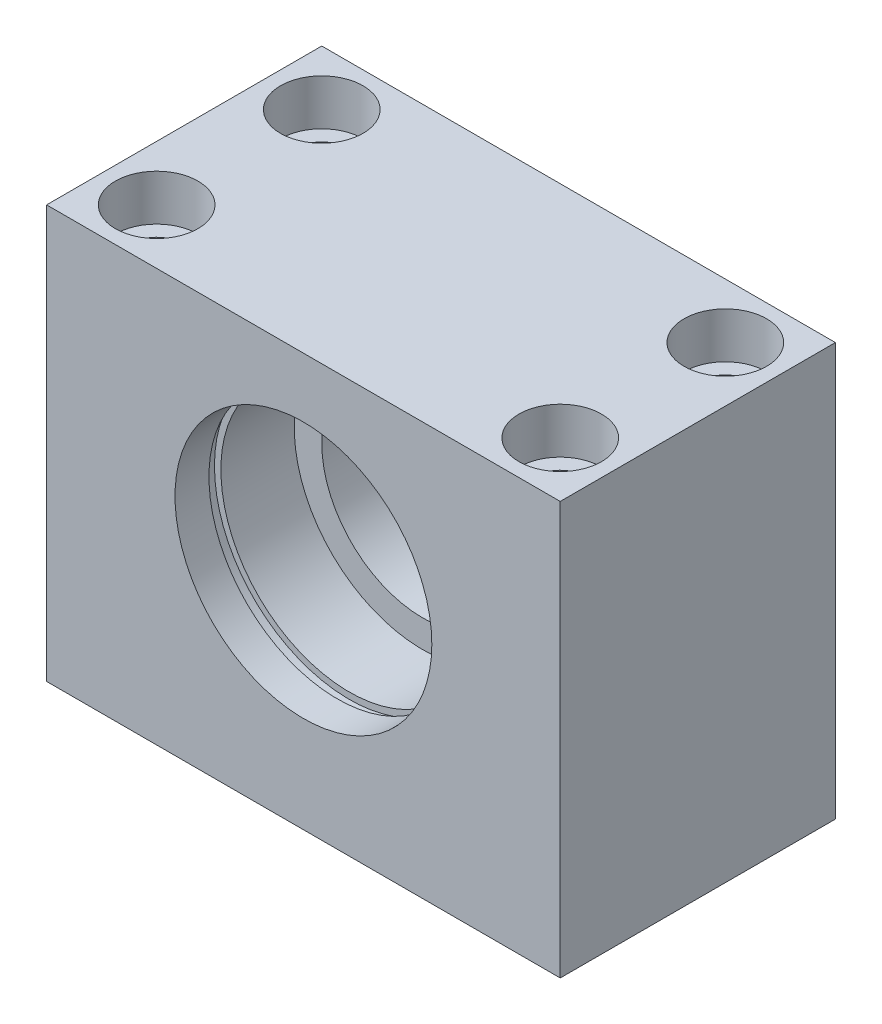
ISO-10303-21;
HEADER;
FILE_DESCRIPTION(('STEP AP214'),'2;1');
FILE_NAME('part.step','',(''),(''),'','','');
FILE_SCHEMA(('AUTOMOTIVE_DESIGN { 1 0 10303 214 1 1 1 1 }'));
ENDSEC;
DATA;
#1=APPLICATION_CONTEXT('core data for automotive mechanical design processes');
#2=APPLICATION_PROTOCOL_DEFINITION('international standard','automotive_design',2000,#1);
#3=PRODUCT_CONTEXT('',#1,'mechanical');
#4=PRODUCT('Part','Part','',(#3));
#5=PRODUCT_RELATED_PRODUCT_CATEGORY('part','',(#4));
#6=PRODUCT_DEFINITION_FORMATION('','',#4);
#7=PRODUCT_DEFINITION_CONTEXT('part definition',#1,'design');
#8=PRODUCT_DEFINITION('design','',#6,#7);
#9=PRODUCT_DEFINITION_SHAPE('','',#8);
#10=(LENGTH_UNIT() NAMED_UNIT(*) SI_UNIT(.MILLI.,.METRE.));
#11=(NAMED_UNIT(*) PLANE_ANGLE_UNIT() SI_UNIT($,.RADIAN.));
#12=(NAMED_UNIT(*) SI_UNIT($,.STERADIAN.) SOLID_ANGLE_UNIT());
#13=UNCERTAINTY_MEASURE_WITH_UNIT(LENGTH_MEASURE(1.E-05),#10,'distance_accuracy_value','');
#14=(GEOMETRIC_REPRESENTATION_CONTEXT(3) GLOBAL_UNCERTAINTY_ASSIGNED_CONTEXT((#13)) GLOBAL_UNIT_ASSIGNED_CONTEXT((#10,
#11,#12)) REPRESENTATION_CONTEXT('',''));
#15=CARTESIAN_POINT('',(0.,0.,0.));
#16=DIRECTION('',(0.,0.,1.));
#17=DIRECTION('',(1.,0.,0.));
#18=AXIS2_PLACEMENT_3D('',#15,#16,#17);
#19=CARTESIAN_POINT('',(0.,24.5,2.));
#20=DIRECTION('',(0.,0.,1.));
#21=DIRECTION('',(1.,0.,0.));
#22=AXIS2_PLACEMENT_3D('',#19,#20,#21);
#23=CYLINDRICAL_SURFACE('',#22,14.);
#24=CARTESIAN_POINT('',(0.,24.5,2.));
#25=DIRECTION('',(0.,0.,1.));
#26=DIRECTION('',(1.,0.,0.));
#27=AXIS2_PLACEMENT_3D('',#24,#25,#26);
#28=CIRCLE('',#27,14.);
#29=CARTESIAN_POINT('',(14.,24.5,2.));
#30=VERTEX_POINT('',#29);
#31=EDGE_CURVE('E117',#30,#30,#28,.T.);
#32=CARTESIAN_POINT('',(0.,24.5,10.));
#33=DIRECTION('',(0.,0.,-1.));
#34=DIRECTION('',(-1.,0.,0.));
#35=AXIS2_PLACEMENT_3D('',#32,#33,#34);
#36=CIRCLE('',#35,14.);
#37=CARTESIAN_POINT('',(14.,24.5,10.));
#38=VERTEX_POINT('',#37);
#39=EDGE_CURVE('E177',#38,#38,#36,.T.);
#40=CARTESIAN_POINT('',(14.,24.5,2.));
#41=CARTESIAN_POINT('',(14.,24.5,2.08333333333333));
#42=CARTESIAN_POINT('',(14.,24.5,2.16666666666667));
#43=CARTESIAN_POINT('',(14.,24.5,2.33333333333333));
#44=CARTESIAN_POINT('',(14.,24.5,2.41666666666667));
#45=CARTESIAN_POINT('',(14.,24.5,2.58333333333333));
#46=CARTESIAN_POINT('',(14.,24.5,2.66666666666667));
#47=CARTESIAN_POINT('',(14.,24.5,2.83333333333333));
#48=CARTESIAN_POINT('',(14.,24.5,2.91666666666667));
#49=CARTESIAN_POINT('',(14.,24.5,3.08333333333333));
#50=CARTESIAN_POINT('',(14.,24.5,3.16666666666667));
#51=CARTESIAN_POINT('',(14.,24.5,3.33333333333333));
#52=CARTESIAN_POINT('',(14.,24.5,3.41666666666667));
#53=CARTESIAN_POINT('',(14.,24.5,3.58333333333333));
#54=CARTESIAN_POINT('',(14.,24.5,3.66666666666667));
#55=CARTESIAN_POINT('',(14.,24.5,3.83333333333333));
#56=CARTESIAN_POINT('',(14.,24.5,3.91666666666667));
#57=CARTESIAN_POINT('',(14.,24.5,4.08333333333333));
#58=CARTESIAN_POINT('',(14.,24.5,4.16666666666667));
#59=CARTESIAN_POINT('',(14.,24.5,4.33333333333333));
#60=CARTESIAN_POINT('',(14.,24.5,4.41666666666667));
#61=CARTESIAN_POINT('',(14.,24.5,4.58333333333333));
#62=CARTESIAN_POINT('',(14.,24.5,4.66666666666667));
#63=CARTESIAN_POINT('',(14.,24.5,4.83333333333333));
#64=CARTESIAN_POINT('',(14.,24.5,4.91666666666667));
#65=CARTESIAN_POINT('',(14.,24.5,5.08333333333333));
#66=CARTESIAN_POINT('',(14.,24.5,5.16666666666667));
#67=CARTESIAN_POINT('',(14.,24.5,5.33333333333333));
#68=CARTESIAN_POINT('',(14.,24.5,5.41666666666667));
#69=CARTESIAN_POINT('',(14.,24.5,5.58333333333333));
#70=CARTESIAN_POINT('',(14.,24.5,5.66666666666667));
#71=CARTESIAN_POINT('',(14.,24.5,5.83333333333333));
#72=CARTESIAN_POINT('',(14.,24.5,5.91666666666667));
#73=CARTESIAN_POINT('',(14.,24.5,6.08333333333333));
#74=CARTESIAN_POINT('',(14.,24.5,6.16666666666667));
#75=CARTESIAN_POINT('',(14.,24.5,6.33333333333333));
#76=CARTESIAN_POINT('',(14.,24.5,6.41666666666667));
#77=CARTESIAN_POINT('',(14.,24.5,6.58333333333333));
#78=CARTESIAN_POINT('',(14.,24.5,6.66666666666667));
#79=CARTESIAN_POINT('',(14.,24.5,6.83333333333333));
#80=CARTESIAN_POINT('',(14.,24.5,6.91666666666667));
#81=CARTESIAN_POINT('',(14.,24.5,7.08333333333333));
#82=CARTESIAN_POINT('',(14.,24.5,7.16666666666667));
#83=CARTESIAN_POINT('',(14.,24.5,7.33333333333333));
#84=CARTESIAN_POINT('',(14.,24.5,7.41666666666667));
#85=CARTESIAN_POINT('',(14.,24.5,7.58333333333333));
#86=CARTESIAN_POINT('',(14.,24.5,7.66666666666667));
#87=CARTESIAN_POINT('',(14.,24.5,7.83333333333333));
#88=CARTESIAN_POINT('',(14.,24.5,7.91666666666667));
#89=CARTESIAN_POINT('',(14.,24.5,8.08333333333333));
#90=CARTESIAN_POINT('',(14.,24.5,8.16666666666667));
#91=CARTESIAN_POINT('',(14.,24.5,8.33333333333333));
#92=CARTESIAN_POINT('',(14.,24.5,8.41666666666667));
#93=CARTESIAN_POINT('',(14.,24.5,8.58333333333333));
#94=CARTESIAN_POINT('',(14.,24.5,8.66666666666667));
#95=CARTESIAN_POINT('',(14.,24.5,8.83333333333333));
#96=CARTESIAN_POINT('',(14.,24.5,8.91666666666667));
#97=CARTESIAN_POINT('',(14.,24.5,9.08333333333333));
#98=CARTESIAN_POINT('',(14.,24.5,9.16666666666667));
#99=CARTESIAN_POINT('',(14.,24.5,9.33333333333333));
#100=CARTESIAN_POINT('',(14.,24.5,9.41666666666667));
#101=CARTESIAN_POINT('',(14.,24.5,9.58333333333333));
#102=CARTESIAN_POINT('',(14.,24.5,9.66666666666667));
#103=CARTESIAN_POINT('',(14.,24.5,9.83333333333333));
#104=CARTESIAN_POINT('',(14.,24.5,9.91666666666667));
#105=CARTESIAN_POINT('',(14.,24.5,10.));
#106=B_SPLINE_CURVE_WITH_KNOTS('',3,(#40,#41,#42,#43,#44,#45,#46,#47,#48,#49,#50,#51,#52,#53,
#54,#55,#56,#57,#58,#59,#60,#61,#62,#63,#64,#65,#66,#67,#68,#69,#70,#71,#72,#73,#74,#75,#76,#77,
#78,#79,#80,#81,#82,#83,#84,#85,#86,#87,#88,#89,#90,#91,#92,#93,#94,#95,#96,#97,#98,#99,#100,
#101,#102,#103,#104,#105),.UNSPECIFIED.,.F.,.F.,(4,2,2,2,2,2,2,2,2,2,2,2,2,2,2,2,2,2,2,2,2,2,2,
2,2,2,2,2,2,2,2,2,4),(0.,0.25,0.5,0.75,1.,1.25,1.5,1.75,2.,2.25,2.5,2.75,3.,3.25,3.5,3.75,4.,
4.25,4.5,4.75,5.,5.25,5.5,5.75,6.,6.25,6.5,6.75,7.,7.25,7.5,7.75,8.),.UNSPECIFIED.);
#107=EDGE_CURVE('BSEAM32',#30,#38,#106,.T.);
#108=ORIENTED_EDGE('',*,*,#31,.F.);
#109=ORIENTED_EDGE('',*,*,#39,.F.);
#110=ORIENTED_EDGE('',*,*,#107,.T.);
#111=ORIENTED_EDGE('',*,*,#107,.F.);
#112=EDGE_LOOP('',(#108,#110,#109,#111));
#113=FACE_BOUND('',#112,.T.);
#114=ADVANCED_FACE('F32',(#113),#23,.F.);
#115=CARTESIAN_POINT('',(0.,24.5,15.));
#116=DIRECTION('',(0.,0.,1.));
#117=DIRECTION('',(1.,0.,0.));
#118=AXIS2_PLACEMENT_3D('',#115,#116,#117);
#119=CIRCLE('',#118,14.);
#120=CARTESIAN_POINT('',(14.,24.5,15.));
#121=VERTEX_POINT('',#120);
#122=EDGE_CURVE('E114',#121,#121,#119,.T.);
#123=CARTESIAN_POINT('',(0.,24.5,11.3));
#124=DIRECTION('',(0.,0.,-1.));
#125=DIRECTION('',(-1.,0.,0.));
#126=AXIS2_PLACEMENT_3D('',#123,#124,#125);
#127=CIRCLE('',#126,14.);
#128=CARTESIAN_POINT('',(14.,24.5,11.3));
#129=VERTEX_POINT('',#128);
#130=EDGE_CURVE('E174',#129,#129,#127,.T.);
#131=CARTESIAN_POINT('',(14.,24.5,15.));
#132=CARTESIAN_POINT('',(14.,24.5,14.9614583333333));
#133=CARTESIAN_POINT('',(14.,24.5,14.9229166666667));
#134=CARTESIAN_POINT('',(14.,24.5,14.8458333333333));
#135=CARTESIAN_POINT('',(14.,24.5,14.8072916666667));
#136=CARTESIAN_POINT('',(14.,24.5,14.7302083333333));
#137=CARTESIAN_POINT('',(14.,24.5,14.6916666666667));
#138=CARTESIAN_POINT('',(14.,24.5,14.6145833333333));
#139=CARTESIAN_POINT('',(14.,24.5,14.5760416666667));
#140=CARTESIAN_POINT('',(14.,24.5,14.4989583333333));
#141=CARTESIAN_POINT('',(14.,24.5,14.4604166666667));
#142=CARTESIAN_POINT('',(14.,24.5,14.3833333333333));
#143=CARTESIAN_POINT('',(14.,24.5,14.3447916666667));
#144=CARTESIAN_POINT('',(14.,24.5,14.2677083333333));
#145=CARTESIAN_POINT('',(14.,24.5,14.2291666666667));
#146=CARTESIAN_POINT('',(14.,24.5,14.1520833333333));
#147=CARTESIAN_POINT('',(14.,24.5,14.1135416666667));
#148=CARTESIAN_POINT('',(14.,24.5,14.0364583333333));
#149=CARTESIAN_POINT('',(14.,24.5,13.9979166666667));
#150=CARTESIAN_POINT('',(14.,24.5,13.9208333333333));
#151=CARTESIAN_POINT('',(14.,24.5,13.8822916666667));
#152=CARTESIAN_POINT('',(14.,24.5,13.8052083333333));
#153=CARTESIAN_POINT('',(14.,24.5,13.7666666666667));
#154=CARTESIAN_POINT('',(14.,24.5,13.6895833333333));
#155=CARTESIAN_POINT('',(14.,24.5,13.6510416666667));
#156=CARTESIAN_POINT('',(14.,24.5,13.5739583333333));
#157=CARTESIAN_POINT('',(14.,24.5,13.5354166666667));
#158=CARTESIAN_POINT('',(14.,24.5,13.4583333333333));
#159=CARTESIAN_POINT('',(14.,24.5,13.4197916666667));
#160=CARTESIAN_POINT('',(14.,24.5,13.3427083333333));
#161=CARTESIAN_POINT('',(14.,24.5,13.3041666666667));
#162=CARTESIAN_POINT('',(14.,24.5,13.2270833333333));
#163=CARTESIAN_POINT('',(14.,24.5,13.1885416666667));
#164=CARTESIAN_POINT('',(14.,24.5,13.1114583333333));
#165=CARTESIAN_POINT('',(14.,24.5,13.0729166666667));
#166=CARTESIAN_POINT('',(14.,24.5,12.9958333333333));
#167=CARTESIAN_POINT('',(14.,24.5,12.9572916666667));
#168=CARTESIAN_POINT('',(14.,24.5,12.8802083333333));
#169=CARTESIAN_POINT('',(14.,24.5,12.8416666666667));
#170=CARTESIAN_POINT('',(14.,24.5,12.7645833333333));
#171=CARTESIAN_POINT('',(14.,24.5,12.7260416666667));
#172=CARTESIAN_POINT('',(14.,24.5,12.6489583333333));
#173=CARTESIAN_POINT('',(14.,24.5,12.6104166666667));
#174=CARTESIAN_POINT('',(14.,24.5,12.5333333333333));
#175=CARTESIAN_POINT('',(14.,24.5,12.4947916666667));
#176=CARTESIAN_POINT('',(14.,24.5,12.4177083333333));
#177=CARTESIAN_POINT('',(14.,24.5,12.3791666666667));
#178=CARTESIAN_POINT('',(14.,24.5,12.3020833333333));
#179=CARTESIAN_POINT('',(14.,24.5,12.2635416666667));
#180=CARTESIAN_POINT('',(14.,24.5,12.1864583333333));
#181=CARTESIAN_POINT('',(14.,24.5,12.1479166666667));
#182=CARTESIAN_POINT('',(14.,24.5,12.0708333333333));
#183=CARTESIAN_POINT('',(14.,24.5,12.0322916666667));
#184=CARTESIAN_POINT('',(14.,24.5,11.9552083333333));
#185=CARTESIAN_POINT('',(14.,24.5,11.9166666666667));
#186=CARTESIAN_POINT('',(14.,24.5,11.8395833333333));
#187=CARTESIAN_POINT('',(14.,24.5,11.8010416666667));
#188=CARTESIAN_POINT('',(14.,24.5,11.7239583333333));
#189=CARTESIAN_POINT('',(14.,24.5,11.6854166666667));
#190=CARTESIAN_POINT('',(14.,24.5,11.6083333333333));
#191=CARTESIAN_POINT('',(14.,24.5,11.5697916666667));
#192=CARTESIAN_POINT('',(14.,24.5,11.4927083333333));
#193=CARTESIAN_POINT('',(14.,24.5,11.4541666666667));
#194=CARTESIAN_POINT('',(14.,24.5,11.3770833333333));
#195=CARTESIAN_POINT('',(14.,24.5,11.3385416666667));
#196=CARTESIAN_POINT('',(14.,24.5,11.3));
#197=B_SPLINE_CURVE_WITH_KNOTS('',3,(#131,#132,#133,#134,#135,#136,#137,#138,#139,#140,#141,
#142,#143,#144,#145,#146,#147,#148,#149,#150,#151,#152,#153,#154,#155,#156,#157,#158,#159,#160,
#161,#162,#163,#164,#165,#166,#167,#168,#169,#170,#171,#172,#173,#174,#175,#176,#177,#178,#179,
#180,#181,#182,#183,#184,#185,#186,#187,#188,#189,#190,#191,#192,#193,#194,#195,#196),
.UNSPECIFIED.,.F.,.F.,(4,2,2,2,2,2,2,2,2,2,2,2,2,2,2,2,2,2,2,2,2,2,2,2,2,2,2,2,2,2,2,2,4),(0.,
0.115624999999999,0.231250000000001,0.346875,0.462500000000001,0.578125000000001,0.69375,
0.809375000000001,0.925,1.040625,1.15625,1.271875,1.3875,1.503125,1.61875,1.734375,1.85,
1.965625,2.08125,2.196875,2.3125,2.428125,2.54375,2.659375,2.775,2.890625,3.00625,3.121875,
3.2375,3.353125,3.46875,3.584375,3.7),.UNSPECIFIED.);
#198=EDGE_CURVE('BSEAM185',#121,#129,#197,.T.);
#199=ORIENTED_EDGE('',*,*,#122,.T.);
#200=ORIENTED_EDGE('',*,*,#130,.T.);
#201=ORIENTED_EDGE('',*,*,#198,.T.);
#202=ORIENTED_EDGE('',*,*,#198,.F.);
#203=EDGE_LOOP('',(#199,#201,#200,#202));
#204=FACE_BOUND('',#203,.T.);
#205=ADVANCED_FACE('F185',(#204),#23,.F.);
#206=CARTESIAN_POINT('',(0.,24.5,-15.));
#207=DIRECTION('',(0.,0.,1.));
#208=DIRECTION('',(1.,0.,0.));
#209=AXIS2_PLACEMENT_3D('',#206,#207,#208);
#210=CYLINDRICAL_SURFACE('',#209,11.);
#211=CARTESIAN_POINT('',(0.,24.5,-15.));
#212=DIRECTION('',(0.,0.,1.));
#213=DIRECTION('',(1.,0.,0.));
#214=AXIS2_PLACEMENT_3D('',#211,#212,#213);
#215=CIRCLE('',#214,11.);
#216=CARTESIAN_POINT('',(11.,24.5,-15.));
#217=VERTEX_POINT('',#216);
#218=EDGE_CURVE('E101',#217,#217,#215,.T.);
#219=ORIENTED_EDGE('',*,*,#218,.F.);
#220=EDGE_LOOP('',(#219));
#221=FACE_BOUND('',#220,.T.);
#222=CARTESIAN_POINT('',(0.,24.5,2.));
#223=DIRECTION('',(0.,0.,1.));
#224=DIRECTION('',(1.,0.,0.));
#225=AXIS2_PLACEMENT_3D('',#222,#223,#224);
#226=CIRCLE('',#225,11.);
#227=CARTESIAN_POINT('',(11.,24.5,2.));
#228=VERTEX_POINT('',#227);
#229=EDGE_CURVE('E36',#228,#228,#226,.F.);
#230=ORIENTED_EDGE('',*,*,#229,.F.);
#231=EDGE_LOOP('',(#230));
#232=FACE_BOUND('',#231,.T.);
#233=ADVANCED_FACE('F191',(#221,#232),#210,.F.);
#234=CARTESIAN_POINT('',(28.,45.,15.));
#235=DIRECTION('',(-1.,0.,0.));
#236=DIRECTION('',(0.,0.,1.));
#237=AXIS2_PLACEMENT_3D('',#234,#235,#236);
#238=PLANE('',#237);
#239=DIRECTION('',(0.,0.,-1.));
#240=VECTOR('',#239,1.);
#241=CARTESIAN_POINT('',(28.,0.,15.));
#242=LINE('',#241,#240);
#243=CARTESIAN_POINT('',(28.,0.,15.));
#244=VERTEX_POINT('',#243);
#245=CARTESIAN_POINT('',(28.,0.,-15.));
#246=VERTEX_POINT('',#245);
#247=EDGE_CURVE('E98',#244,#246,#242,.T.);
#248=ORIENTED_EDGE('',*,*,#247,.T.);
#249=DIRECTION('',(0.,-1.,0.));
#250=VECTOR('',#249,1.);
#251=CARTESIAN_POINT('',(28.,45.,-15.));
#252=LINE('',#251,#250);
#253=CARTESIAN_POINT('',(28.,45.,-15.));
#254=VERTEX_POINT('',#253);
#255=EDGE_CURVE('E11',#254,#246,#252,.T.);
#256=ORIENTED_EDGE('',*,*,#255,.F.);
#257=DIRECTION('',(0.,0.,-1.));
#258=VECTOR('',#257,1.);
#259=CARTESIAN_POINT('',(28.,45.,15.));
#260=LINE('',#259,#258);
#261=CARTESIAN_POINT('',(28.,45.,15.));
#262=VERTEX_POINT('',#261);
#263=EDGE_CURVE('E85',#262,#254,#260,.T.);
#264=ORIENTED_EDGE('',*,*,#263,.F.);
#265=DIRECTION('',(0.,-1.,0.));
#266=VECTOR('',#265,1.);
#267=CARTESIAN_POINT('',(28.,45.,15.));
#268=LINE('',#267,#266);
#269=EDGE_CURVE('E94',#262,#244,#268,.T.);
#270=ORIENTED_EDGE('',*,*,#269,.T.);
#271=EDGE_LOOP('',(#248,#256,#264,#270));
#272=FACE_BOUND('',#271,.T.);
#273=ADVANCED_FACE('F34',(#272),#238,.F.);
#274=CARTESIAN_POINT('',(-28.,45.,-15.));
#275=DIRECTION('',(0.,0.,1.));
#276=DIRECTION('',(1.,0.,0.));
#277=AXIS2_PLACEMENT_3D('',#274,#275,#276);
#278=PLANE('',#277);
#279=ORIENTED_EDGE('',*,*,#218,.T.);
#280=EDGE_LOOP('',(#279));
#281=FACE_BOUND('',#280,.T.);
#282=DIRECTION('',(-1.,0.,0.));
#283=VECTOR('',#282,1.);
#284=CARTESIAN_POINT('',(-28.,0.,-15.));
#285=LINE('',#284,#283);
#286=CARTESIAN_POINT('',(-28.,0.,-15.));
#287=VERTEX_POINT('',#286);
#288=EDGE_CURVE('E89',#246,#287,#285,.T.);
#289=ORIENTED_EDGE('',*,*,#288,.T.);
#290=DIRECTION('',(0.,-1.,0.));
#291=VECTOR('',#290,1.);
#292=CARTESIAN_POINT('',(-28.,45.,-15.));
#293=LINE('',#292,#291);
#294=CARTESIAN_POINT('',(-28.,45.,-15.));
#295=VERTEX_POINT('',#294);
#296=EDGE_CURVE('E42',#295,#287,#293,.T.);
#297=ORIENTED_EDGE('',*,*,#296,.F.);
#298=DIRECTION('',(-1.,0.,0.));
#299=VECTOR('',#298,1.);
#300=CARTESIAN_POINT('',(-28.,45.,-15.));
#301=LINE('',#300,#299);
#302=EDGE_CURVE('E80',#254,#295,#301,.T.);
#303=ORIENTED_EDGE('',*,*,#302,.F.);
#304=ORIENTED_EDGE('',*,*,#255,.T.);
#305=EDGE_LOOP('',(#289,#297,#303,#304));
#306=FACE_BOUND('',#305,.T.);
#307=ADVANCED_FACE('F88',(#281,#306),#278,.F.);
#308=CARTESIAN_POINT('',(-28.,45.,15.));
#309=DIRECTION('',(1.,0.,0.));
#310=DIRECTION('',(0.,0.,-1.));
#311=AXIS2_PLACEMENT_3D('',#308,#309,#310);
#312=PLANE('',#311);
#313=DIRECTION('',(0.,0.,1.));
#314=VECTOR('',#313,1.);
#315=CARTESIAN_POINT('',(-28.,0.,15.));
#316=LINE('',#315,#314);
#317=CARTESIAN_POINT('',(-28.,0.,15.));
#318=VERTEX_POINT('',#317);
#319=EDGE_CURVE('E67',#287,#318,#316,.T.);
#320=ORIENTED_EDGE('',*,*,#319,.T.);
#321=DIRECTION('',(0.,-1.,0.));
#322=VECTOR('',#321,1.);
#323=CARTESIAN_POINT('',(-28.,45.,15.));
#324=LINE('',#323,#322);
#325=CARTESIAN_POINT('',(-28.,45.,15.));
#326=VERTEX_POINT('',#325);
#327=EDGE_CURVE('E90',#326,#318,#324,.T.);
#328=ORIENTED_EDGE('',*,*,#327,.F.);
#329=DIRECTION('',(0.,0.,1.));
#330=VECTOR('',#329,1.);
#331=CARTESIAN_POINT('',(-28.,45.,15.));
#332=LINE('',#331,#330);
#333=EDGE_CURVE('E83',#295,#326,#332,.T.);
#334=ORIENTED_EDGE('',*,*,#333,.F.);
#335=ORIENTED_EDGE('',*,*,#296,.T.);
#336=EDGE_LOOP('',(#320,#328,#334,#335));
#337=FACE_BOUND('',#336,.T.);
#338=ADVANCED_FACE('F92',(#337),#312,.F.);
#339=CARTESIAN_POINT('',(-28.,45.,15.));
#340=DIRECTION('',(0.,0.,-1.));
#341=DIRECTION('',(-1.,0.,0.));
#342=AXIS2_PLACEMENT_3D('',#339,#340,#341);
#343=PLANE('',#342);
#344=ORIENTED_EDGE('',*,*,#122,.F.);
#345=EDGE_LOOP('',(#344));
#346=FACE_BOUND('',#345,.T.);
#347=DIRECTION('',(1.,0.,0.));
#348=VECTOR('',#347,1.);
#349=CARTESIAN_POINT('',(-28.,0.,15.));
#350=LINE('',#349,#348);
#351=EDGE_CURVE('E73',#318,#244,#350,.T.);
#352=ORIENTED_EDGE('',*,*,#351,.T.);
#353=ORIENTED_EDGE('',*,*,#269,.F.);
#354=DIRECTION('',(1.,0.,0.));
#355=VECTOR('',#354,1.);
#356=CARTESIAN_POINT('',(-28.,45.,15.));
#357=LINE('',#356,#355);
#358=EDGE_CURVE('E50',#326,#262,#357,.T.);
#359=ORIENTED_EDGE('',*,*,#358,.F.);
#360=ORIENTED_EDGE('',*,*,#327,.T.);
#361=EDGE_LOOP('',(#352,#353,#359,#360));
#362=FACE_BOUND('',#361,.T.);
#363=ADVANCED_FACE('F106',(#346,#362),#343,.F.);
#364=CARTESIAN_POINT('',(0.,45.,0.));
#365=DIRECTION('',(0.,-1.,0.));
#366=DIRECTION('',(0.,0.,-1.));
#367=AXIS2_PLACEMENT_3D('',#364,#365,#366);
#368=PLANE('',#367);
#369=CARTESIAN_POINT('',(22.,45.,-9.));
#370=DIRECTION('',(0.,1.,0.));
#371=DIRECTION('',(0.,0.,1.));
#372=AXIS2_PLACEMENT_3D('',#369,#370,#371);
#373=CIRCLE('',#372,4.49999999999999);
#374=CARTESIAN_POINT('',(22.,45.,-4.50000000000001));
#375=VERTEX_POINT('',#374);
#376=EDGE_CURVE('E165',#375,#375,#373,.T.);
#377=ORIENTED_EDGE('',*,*,#376,.F.);
#378=EDGE_LOOP('',(#377));
#379=FACE_BOUND('',#378,.T.);
#380=CARTESIAN_POINT('',(22.,45.,9.));
#381=DIRECTION('',(0.,1.,0.));
#382=DIRECTION('',(0.,0.,1.));
#383=AXIS2_PLACEMENT_3D('',#380,#381,#382);
#384=CIRCLE('',#383,4.49999999999999);
#385=CARTESIAN_POINT('',(22.,45.,13.5));
#386=VERTEX_POINT('',#385);
#387=EDGE_CURVE('E153',#386,#386,#384,.T.);
#388=ORIENTED_EDGE('',*,*,#387,.F.);
#389=EDGE_LOOP('',(#388));
#390=FACE_BOUND('',#389,.T.);
#391=CARTESIAN_POINT('',(-22.,45.,9.));
#392=DIRECTION('',(0.,1.,0.));
#393=DIRECTION('',(0.,0.,1.));
#394=AXIS2_PLACEMENT_3D('',#391,#392,#393);
#395=CIRCLE('',#394,4.49999999999999);
#396=CARTESIAN_POINT('',(-22.,45.,13.5));
#397=VERTEX_POINT('',#396);
#398=EDGE_CURVE('E141',#397,#397,#395,.T.);
#399=ORIENTED_EDGE('',*,*,#398,.F.);
#400=EDGE_LOOP('',(#399));
#401=FACE_BOUND('',#400,.T.);
#402=CARTESIAN_POINT('',(-22.,45.,-9.));
#403=DIRECTION('',(0.,1.,0.));
#404=DIRECTION('',(0.,0.,1.));
#405=AXIS2_PLACEMENT_3D('',#402,#403,#404);
#406=CIRCLE('',#405,4.49999999999999);
#407=CARTESIAN_POINT('',(-22.,45.,-4.50000000000001));
#408=VERTEX_POINT('',#407);
#409=EDGE_CURVE('E129',#408,#408,#406,.T.);
#410=ORIENTED_EDGE('',*,*,#409,.F.);
#411=EDGE_LOOP('',(#410));
#412=FACE_BOUND('',#411,.T.);
#413=ORIENTED_EDGE('',*,*,#263,.T.);
#414=ORIENTED_EDGE('',*,*,#302,.T.);
#415=ORIENTED_EDGE('',*,*,#333,.T.);
#416=ORIENTED_EDGE('',*,*,#358,.T.);
#417=EDGE_LOOP('',(#413,#414,#415,#416));
#418=FACE_BOUND('',#417,.T.);
#419=ADVANCED_FACE('F81',(#379,#390,#401,#412,#418),#368,.F.);
#420=CARTESIAN_POINT('',(0.,0.,0.));
#421=DIRECTION('',(0.,-1.,0.));
#422=DIRECTION('',(0.,0.,-1.));
#423=AXIS2_PLACEMENT_3D('',#420,#421,#422);
#424=PLANE('',#423);
#425=CARTESIAN_POINT('',(22.,0.,-9.));
#426=DIRECTION('',(0.,1.,0.));
#427=DIRECTION('',(0.,0.,1.));
#428=AXIS2_PLACEMENT_3D('',#425,#426,#427);
#429=CIRCLE('',#428,2.74999999999999);
#430=CARTESIAN_POINT('',(22.,0.,-6.25000000000001));
#431=VERTEX_POINT('',#430);
#432=EDGE_CURVE('E156',#431,#431,#429,.T.);
#433=ORIENTED_EDGE('',*,*,#432,.T.);
#434=EDGE_LOOP('',(#433));
#435=FACE_BOUND('',#434,.T.);
#436=CARTESIAN_POINT('',(22.,0.,9.));
#437=DIRECTION('',(0.,1.,0.));
#438=DIRECTION('',(0.,0.,1.));
#439=AXIS2_PLACEMENT_3D('',#436,#437,#438);
#440=CIRCLE('',#439,2.74999999999999);
#441=CARTESIAN_POINT('',(22.,0.,11.75));
#442=VERTEX_POINT('',#441);
#443=EDGE_CURVE('E144',#442,#442,#440,.T.);
#444=ORIENTED_EDGE('',*,*,#443,.T.);
#445=EDGE_LOOP('',(#444));
#446=FACE_BOUND('',#445,.T.);
#447=CARTESIAN_POINT('',(-22.,0.,9.));
#448=DIRECTION('',(0.,1.,0.));
#449=DIRECTION('',(0.,0.,1.));
#450=AXIS2_PLACEMENT_3D('',#447,#448,#449);
#451=CIRCLE('',#450,2.74999999999999);
#452=CARTESIAN_POINT('',(-22.,0.,11.75));
#453=VERTEX_POINT('',#452);
#454=EDGE_CURVE('E132',#453,#453,#451,.T.);
#455=ORIENTED_EDGE('',*,*,#454,.T.);
#456=EDGE_LOOP('',(#455));
#457=FACE_BOUND('',#456,.T.);
#458=CARTESIAN_POINT('',(-22.,0.,-9.));
#459=DIRECTION('',(0.,1.,0.));
#460=DIRECTION('',(0.,0.,1.));
#461=AXIS2_PLACEMENT_3D('',#458,#459,#460);
#462=CIRCLE('',#461,2.74999999999999);
#463=CARTESIAN_POINT('',(-22.,0.,-6.25000000000001));
#464=VERTEX_POINT('',#463);
#465=EDGE_CURVE('E118',#464,#464,#462,.T.);
#466=ORIENTED_EDGE('',*,*,#465,.T.);
#467=EDGE_LOOP('',(#466));
#468=FACE_BOUND('',#467,.T.);
#469=ORIENTED_EDGE('',*,*,#247,.F.);
#470=ORIENTED_EDGE('',*,*,#351,.F.);
#471=ORIENTED_EDGE('',*,*,#319,.F.);
#472=ORIENTED_EDGE('',*,*,#288,.F.);
#473=EDGE_LOOP('',(#469,#470,#471,#472));
#474=FACE_BOUND('',#473,.T.);
#475=ADVANCED_FACE('F109',(#435,#446,#457,#468,#474),#424,.T.);
#476=CARTESIAN_POINT('',(0.,24.5,2.));
#477=DIRECTION('',(0.,0.,1.));
#478=DIRECTION('',(1.,0.,0.));
#479=AXIS2_PLACEMENT_3D('',#476,#477,#478);
#480=PLANE('',#479);
#481=ORIENTED_EDGE('',*,*,#31,.T.);
#482=EDGE_LOOP('',(#481));
#483=FACE_BOUND('',#482,.T.);
#484=ORIENTED_EDGE('',*,*,#229,.T.);
#485=EDGE_LOOP('',(#484));
#486=FACE_BOUND('',#485,.T.);
#487=ADVANCED_FACE('F196',(#483,#486),#480,.T.);
#488=CARTESIAN_POINT('',(-22.,45.,-9.));
#489=DIRECTION('',(0.,1.,0.));
#490=DIRECTION('',(0.,0.,1.));
#491=AXIS2_PLACEMENT_3D('',#488,#489,#490);
#492=CYLINDRICAL_SURFACE('',#491,2.75);
#493=ORIENTED_EDGE('',*,*,#465,.F.);
#494=EDGE_LOOP('',(#493));
#495=FACE_BOUND('',#494,.T.);
#496=CARTESIAN_POINT('',(-22.,40.,-9.));
#497=DIRECTION('',(0.,1.,0.));
#498=DIRECTION('',(0.,0.,1.));
#499=AXIS2_PLACEMENT_3D('',#496,#497,#498);
#500=CIRCLE('',#499,2.75000000000001);
#501=CARTESIAN_POINT('',(-22.,40.,-6.24999999999999));
#502=VERTEX_POINT('',#501);
#503=EDGE_CURVE('E123',#502,#502,#500,.T.);
#504=ORIENTED_EDGE('',*,*,#503,.T.);
#505=EDGE_LOOP('',(#504));
#506=FACE_BOUND('',#505,.T.);
#507=ADVANCED_FACE('F222',(#495,#506),#492,.F.);
#508=CARTESIAN_POINT('',(-19.25,40.,-9.));
#509=DIRECTION('',(0.,-1.,0.));
#510=DIRECTION('',(0.,0.,-1.));
#511=AXIS2_PLACEMENT_3D('',#508,#509,#510);
#512=PLANE('',#511);
#513=ORIENTED_EDGE('',*,*,#503,.F.);
#514=EDGE_LOOP('',(#513));
#515=FACE_BOUND('',#514,.T.);
#516=CARTESIAN_POINT('',(-22.,40.,-9.));
#517=DIRECTION('',(0.,1.,0.));
#518=DIRECTION('',(0.,0.,1.));
#519=AXIS2_PLACEMENT_3D('',#516,#517,#518);
#520=CIRCLE('',#519,4.49999999999999);
#521=CARTESIAN_POINT('',(-22.,40.,-4.50000000000001));
#522=VERTEX_POINT('',#521);
#523=EDGE_CURVE('E126',#522,#522,#520,.T.);
#524=ORIENTED_EDGE('',*,*,#523,.T.);
#525=EDGE_LOOP('',(#524));
#526=FACE_BOUND('',#525,.T.);
#527=ADVANCED_FACE('F227',(#515,#526),#512,.F.);
#528=CARTESIAN_POINT('',(-22.,45.,-9.));
#529=DIRECTION('',(0.,1.,0.));
#530=DIRECTION('',(0.,0.,1.));
#531=AXIS2_PLACEMENT_3D('',#528,#529,#530);
#532=CYLINDRICAL_SURFACE('',#531,4.49999999999999);
#533=ORIENTED_EDGE('',*,*,#523,.F.);
#534=EDGE_LOOP('',(#533));
#535=FACE_BOUND('',#534,.T.);
#536=ORIENTED_EDGE('',*,*,#409,.T.);
#537=EDGE_LOOP('',(#536));
#538=FACE_BOUND('',#537,.T.);
#539=ADVANCED_FACE('F232',(#535,#538),#532,.F.);
#540=CARTESIAN_POINT('',(-22.,45.,9.));
#541=DIRECTION('',(0.,1.,0.));
#542=DIRECTION('',(0.,0.,1.));
#543=AXIS2_PLACEMENT_3D('',#540,#541,#542);
#544=CYLINDRICAL_SURFACE('',#543,2.75);
#545=ORIENTED_EDGE('',*,*,#454,.F.);
#546=EDGE_LOOP('',(#545));
#547=FACE_BOUND('',#546,.T.);
#548=CARTESIAN_POINT('',(-22.,40.,9.));
#549=DIRECTION('',(0.,1.,0.));
#550=DIRECTION('',(0.,0.,1.));
#551=AXIS2_PLACEMENT_3D('',#548,#549,#550);
#552=CIRCLE('',#551,2.75000000000001);
#553=CARTESIAN_POINT('',(-22.,40.,11.75));
#554=VERTEX_POINT('',#553);
#555=EDGE_CURVE('E135',#554,#554,#552,.T.);
#556=ORIENTED_EDGE('',*,*,#555,.T.);
#557=EDGE_LOOP('',(#556));
#558=FACE_BOUND('',#557,.T.);
#559=ADVANCED_FACE('F240',(#547,#558),#544,.F.);
#560=CARTESIAN_POINT('',(-19.25,40.,9.));
#561=DIRECTION('',(0.,-1.,0.));
#562=DIRECTION('',(0.,0.,-1.));
#563=AXIS2_PLACEMENT_3D('',#560,#561,#562);
#564=PLANE('',#563);
#565=ORIENTED_EDGE('',*,*,#555,.F.);
#566=EDGE_LOOP('',(#565));
#567=FACE_BOUND('',#566,.T.);
#568=CARTESIAN_POINT('',(-22.,40.,9.));
#569=DIRECTION('',(0.,1.,0.));
#570=DIRECTION('',(0.,0.,1.));
#571=AXIS2_PLACEMENT_3D('',#568,#569,#570);
#572=CIRCLE('',#571,4.49999999999999);
#573=CARTESIAN_POINT('',(-22.,40.,13.5));
#574=VERTEX_POINT('',#573);
#575=EDGE_CURVE('E138',#574,#574,#572,.T.);
#576=ORIENTED_EDGE('',*,*,#575,.T.);
#577=EDGE_LOOP('',(#576));
#578=FACE_BOUND('',#577,.T.);
#579=ADVANCED_FACE('F244',(#567,#578),#564,.F.);
#580=CARTESIAN_POINT('',(-22.,45.,9.));
#581=DIRECTION('',(0.,1.,0.));
#582=DIRECTION('',(0.,0.,1.));
#583=AXIS2_PLACEMENT_3D('',#580,#581,#582);
#584=CYLINDRICAL_SURFACE('',#583,4.49999999999999);
#585=ORIENTED_EDGE('',*,*,#575,.F.);
#586=EDGE_LOOP('',(#585));
#587=FACE_BOUND('',#586,.T.);
#588=ORIENTED_EDGE('',*,*,#398,.T.);
#589=EDGE_LOOP('',(#588));
#590=FACE_BOUND('',#589,.T.);
#591=ADVANCED_FACE('F248',(#587,#590),#584,.F.);
#592=CARTESIAN_POINT('',(22.,45.,9.));
#593=DIRECTION('',(0.,1.,0.));
#594=DIRECTION('',(0.,0.,1.));
#595=AXIS2_PLACEMENT_3D('',#592,#593,#594);
#596=CYLINDRICAL_SURFACE('',#595,2.75);
#597=ORIENTED_EDGE('',*,*,#443,.F.);
#598=EDGE_LOOP('',(#597));
#599=FACE_BOUND('',#598,.T.);
#600=CARTESIAN_POINT('',(22.,40.,9.));
#601=DIRECTION('',(0.,1.,0.));
#602=DIRECTION('',(0.,0.,1.));
#603=AXIS2_PLACEMENT_3D('',#600,#601,#602);
#604=CIRCLE('',#603,2.75000000000001);
#605=CARTESIAN_POINT('',(22.,40.,11.75));
#606=VERTEX_POINT('',#605);
#607=EDGE_CURVE('E147',#606,#606,#604,.T.);
#608=ORIENTED_EDGE('',*,*,#607,.T.);
#609=EDGE_LOOP('',(#608));
#610=FACE_BOUND('',#609,.T.);
#611=ADVANCED_FACE('F252',(#599,#610),#596,.F.);
#612=CARTESIAN_POINT('',(24.75,40.,9.));
#613=DIRECTION('',(0.,-1.,0.));
#614=DIRECTION('',(0.,0.,-1.));
#615=AXIS2_PLACEMENT_3D('',#612,#613,#614);
#616=PLANE('',#615);
#617=ORIENTED_EDGE('',*,*,#607,.F.);
#618=EDGE_LOOP('',(#617));
#619=FACE_BOUND('',#618,.T.);
#620=CARTESIAN_POINT('',(22.,40.,9.));
#621=DIRECTION('',(0.,1.,0.));
#622=DIRECTION('',(0.,0.,1.));
#623=AXIS2_PLACEMENT_3D('',#620,#621,#622);
#624=CIRCLE('',#623,4.49999999999999);
#625=CARTESIAN_POINT('',(22.,40.,13.5));
#626=VERTEX_POINT('',#625);
#627=EDGE_CURVE('E150',#626,#626,#624,.T.);
#628=ORIENTED_EDGE('',*,*,#627,.T.);
#629=EDGE_LOOP('',(#628));
#630=FACE_BOUND('',#629,.T.);
#631=ADVANCED_FACE('F256',(#619,#630),#616,.F.);
#632=CARTESIAN_POINT('',(22.,45.,9.));
#633=DIRECTION('',(0.,1.,0.));
#634=DIRECTION('',(0.,0.,1.));
#635=AXIS2_PLACEMENT_3D('',#632,#633,#634);
#636=CYLINDRICAL_SURFACE('',#635,4.49999999999999);
#637=ORIENTED_EDGE('',*,*,#627,.F.);
#638=EDGE_LOOP('',(#637));
#639=FACE_BOUND('',#638,.T.);
#640=ORIENTED_EDGE('',*,*,#387,.T.);
#641=EDGE_LOOP('',(#640));
#642=FACE_BOUND('',#641,.T.);
#643=ADVANCED_FACE('F260',(#639,#642),#636,.F.);
#644=CARTESIAN_POINT('',(22.,45.,-9.));
#645=DIRECTION('',(0.,1.,0.));
#646=DIRECTION('',(0.,0.,1.));
#647=AXIS2_PLACEMENT_3D('',#644,#645,#646);
#648=CYLINDRICAL_SURFACE('',#647,2.75);
#649=ORIENTED_EDGE('',*,*,#432,.F.);
#650=EDGE_LOOP('',(#649));
#651=FACE_BOUND('',#650,.T.);
#652=CARTESIAN_POINT('',(22.,40.,-9.));
#653=DIRECTION('',(0.,1.,0.));
#654=DIRECTION('',(0.,0.,1.));
#655=AXIS2_PLACEMENT_3D('',#652,#653,#654);
#656=CIRCLE('',#655,2.75000000000001);
#657=CARTESIAN_POINT('',(22.,40.,-6.24999999999999));
#658=VERTEX_POINT('',#657);
#659=EDGE_CURVE('E159',#658,#658,#656,.T.);
#660=ORIENTED_EDGE('',*,*,#659,.T.);
#661=EDGE_LOOP('',(#660));
#662=FACE_BOUND('',#661,.T.);
#663=ADVANCED_FACE('F264',(#651,#662),#648,.F.);
#664=CARTESIAN_POINT('',(24.75,40.,-9.));
#665=DIRECTION('',(0.,-1.,0.));
#666=DIRECTION('',(0.,0.,-1.));
#667=AXIS2_PLACEMENT_3D('',#664,#665,#666);
#668=PLANE('',#667);
#669=ORIENTED_EDGE('',*,*,#659,.F.);
#670=EDGE_LOOP('',(#669));
#671=FACE_BOUND('',#670,.T.);
#672=CARTESIAN_POINT('',(22.,40.,-9.));
#673=DIRECTION('',(0.,1.,0.));
#674=DIRECTION('',(0.,0.,1.));
#675=AXIS2_PLACEMENT_3D('',#672,#673,#674);
#676=CIRCLE('',#675,4.49999999999999);
#677=CARTESIAN_POINT('',(22.,40.,-4.50000000000001));
#678=VERTEX_POINT('',#677);
#679=EDGE_CURVE('E162',#678,#678,#676,.T.);
#680=ORIENTED_EDGE('',*,*,#679,.T.);
#681=EDGE_LOOP('',(#680));
#682=FACE_BOUND('',#681,.T.);
#683=ADVANCED_FACE('F268',(#671,#682),#668,.F.);
#684=CARTESIAN_POINT('',(22.,45.,-9.));
#685=DIRECTION('',(0.,1.,0.));
#686=DIRECTION('',(0.,0.,1.));
#687=AXIS2_PLACEMENT_3D('',#684,#685,#686);
#688=CYLINDRICAL_SURFACE('',#687,4.49999999999999);
#689=ORIENTED_EDGE('',*,*,#679,.F.);
#690=EDGE_LOOP('',(#689));
#691=FACE_BOUND('',#690,.T.);
#692=ORIENTED_EDGE('',*,*,#376,.T.);
#693=EDGE_LOOP('',(#692));
#694=FACE_BOUND('',#693,.T.);
#695=ADVANCED_FACE('F272',(#691,#694),#688,.F.);
#696=CARTESIAN_POINT('',(0.,10.5,10.));
#697=DIRECTION('',(0.,0.,1.));
#698=DIRECTION('',(1.,0.,0.));
#699=AXIS2_PLACEMENT_3D('',#696,#697,#698);
#700=PLANE('',#699);
#701=ORIENTED_EDGE('',*,*,#39,.T.);
#702=EDGE_LOOP('',(#701));
#703=FACE_BOUND('',#702,.T.);
#704=CARTESIAN_POINT('',(0.,24.5,10.));
#705=DIRECTION('',(0.,0.,-1.));
#706=DIRECTION('',(-1.,0.,0.));
#707=AXIS2_PLACEMENT_3D('',#704,#705,#706);
#708=CIRCLE('',#707,14.7);
#709=CARTESIAN_POINT('',(-14.7,24.5,10.));
#710=VERTEX_POINT('',#709);
#711=EDGE_CURVE('E168',#710,#710,#708,.T.);
#712=ORIENTED_EDGE('',*,*,#711,.F.);
#713=EDGE_LOOP('',(#712));
#714=FACE_BOUND('',#713,.T.);
#715=ADVANCED_FACE('F181',(#703,#714),#700,.T.);
#716=CARTESIAN_POINT('',(0.,24.5,9.2946491171233));
#717=DIRECTION('',(0.,0.,-1.));
#718=DIRECTION('',(-1.,0.,0.));
#719=AXIS2_PLACEMENT_3D('',#716,#717,#718);
#720=CYLINDRICAL_SURFACE('',#719,14.7);
#721=ORIENTED_EDGE('',*,*,#711,.T.);
#722=EDGE_LOOP('',(#721));
#723=FACE_BOUND('',#722,.T.);
#724=CARTESIAN_POINT('',(0.,24.5,11.3));
#725=DIRECTION('',(0.,0.,-1.));
#726=DIRECTION('',(-1.,0.,0.));
#727=AXIS2_PLACEMENT_3D('',#724,#725,#726);
#728=CIRCLE('',#727,14.7);
#729=CARTESIAN_POINT('',(-14.7,24.5,11.3));
#730=VERTEX_POINT('',#729);
#731=EDGE_CURVE('E171',#730,#730,#728,.T.);
#732=ORIENTED_EDGE('',*,*,#731,.F.);
#733=EDGE_LOOP('',(#732));
#734=FACE_BOUND('',#733,.T.);
#735=ADVANCED_FACE('F279',(#723,#734),#720,.F.);
#736=CARTESIAN_POINT('',(0.,10.5,11.3));
#737=DIRECTION('',(0.,0.,-1.));
#738=DIRECTION('',(-1.,0.,0.));
#739=AXIS2_PLACEMENT_3D('',#736,#737,#738);
#740=PLANE('',#739);
#741=ORIENTED_EDGE('',*,*,#731,.T.);
#742=EDGE_LOOP('',(#741));
#743=FACE_BOUND('',#742,.T.);
#744=ORIENTED_EDGE('',*,*,#130,.F.);
#745=EDGE_LOOP('',(#744));
#746=FACE_BOUND('',#745,.T.);
#747=ADVANCED_FACE('F282',(#743,#746),#740,.T.);
#748=CLOSED_SHELL('',(#114,#205,#233,#273,#307,#338,#363,#419,#475,#487,#507,#527,#539,#559,
#579,#591,#611,#631,#643,#663,#683,#695,#715,#735,#747));
#749=MANIFOLD_SOLID_BREP('B2',#748);
#750=ADVANCED_BREP_SHAPE_REPRESENTATION('',(#18,#749),#14);
#751=SHAPE_DEFINITION_REPRESENTATION(#9,#750);
ENDSEC;
END-ISO-10303-21;
